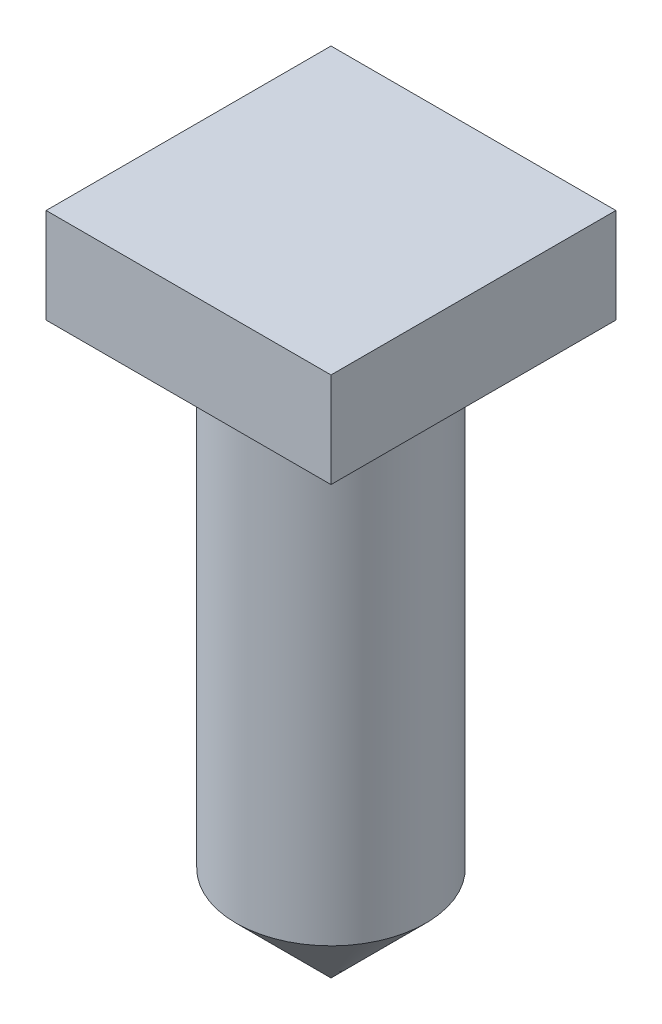
ISO-10303-21;
HEADER;
FILE_DESCRIPTION(('STEP AP214'),'2;1');
FILE_NAME('part.step','',(''),(''),'','','');
FILE_SCHEMA(('AUTOMOTIVE_DESIGN { 1 0 10303 214 1 1 1 1 }'));
ENDSEC;
DATA;
#1=APPLICATION_CONTEXT('core data for automotive mechanical design processes');
#2=APPLICATION_PROTOCOL_DEFINITION('international standard','automotive_design',2000,#1);
#3=PRODUCT_CONTEXT('',#1,'mechanical');
#4=PRODUCT('Part','Part','',(#3));
#5=PRODUCT_RELATED_PRODUCT_CATEGORY('part','',(#4));
#6=PRODUCT_DEFINITION_FORMATION('','',#4);
#7=PRODUCT_DEFINITION_CONTEXT('part definition',#1,'design');
#8=PRODUCT_DEFINITION('design','',#6,#7);
#9=PRODUCT_DEFINITION_SHAPE('','',#8);
#10=(LENGTH_UNIT() NAMED_UNIT(*) SI_UNIT(.MILLI.,.METRE.));
#11=(NAMED_UNIT(*) PLANE_ANGLE_UNIT() SI_UNIT($,.RADIAN.));
#12=(NAMED_UNIT(*) SI_UNIT($,.STERADIAN.) SOLID_ANGLE_UNIT());
#13=UNCERTAINTY_MEASURE_WITH_UNIT(LENGTH_MEASURE(1.E-05),#10,'distance_accuracy_value','');
#14=(GEOMETRIC_REPRESENTATION_CONTEXT(3) GLOBAL_UNCERTAINTY_ASSIGNED_CONTEXT((#13)) GLOBAL_UNIT_ASSIGNED_CONTEXT((#10,
#11,#12)) REPRESENTATION_CONTEXT('',''));
#15=CARTESIAN_POINT('',(0.,0.,0.));
#16=DIRECTION('',(0.,0.,1.));
#17=DIRECTION('',(1.,0.,0.));
#18=AXIS2_PLACEMENT_3D('',#15,#16,#17);
#19=CARTESIAN_POINT('',(0.,0.,0.));
#20=DIRECTION('',(0.,1.,0.));
#21=DIRECTION('',(0.,0.,1.));
#22=AXIS2_PLACEMENT_3D('',#19,#20,#21);
#23=CONICAL_SURFACE('',#22,2.,0.78539816339745);
#24=CARTESIAN_POINT('',(0.,-1.99999999999999,0.));
#25=VERTEX_POINT('',#24);
#26=VERTEX_LOOP('',#25);
#27=FACE_BOUND('',#26,.T.);
#28=CARTESIAN_POINT('',(0.,0.,0.));
#29=DIRECTION('',(0.,1.,0.));
#30=DIRECTION('',(0.,0.,1.));
#31=AXIS2_PLACEMENT_3D('',#28,#29,#30);
#32=CIRCLE('',#31,2.);
#33=CARTESIAN_POINT('',(0.,0.,2.));
#34=VERTEX_POINT('',#33);
#35=EDGE_CURVE('E11',#34,#34,#32,.T.);
#36=ORIENTED_EDGE('',*,*,#35,.F.);
#37=EDGE_LOOP('',(#36));
#38=FACE_BOUND('',#37,.T.);
#39=ADVANCED_FACE('F33',(#27,#38),#23,.T.);
#40=CARTESIAN_POINT('',(0.,10.,0.));
#41=DIRECTION('',(0.,-1.,0.));
#42=DIRECTION('',(0.,0.,-1.));
#43=AXIS2_PLACEMENT_3D('',#40,#41,#42);
#44=CYLINDRICAL_SURFACE('',#43,2.);
#45=CARTESIAN_POINT('',(0.,10.,0.));
#46=DIRECTION('',(0.,1.,0.));
#47=DIRECTION('',(0.,0.,1.));
#48=AXIS2_PLACEMENT_3D('',#45,#46,#47);
#49=CIRCLE('',#48,2.);
#50=CARTESIAN_POINT('',(0.,10.,2.));
#51=VERTEX_POINT('',#50);
#52=EDGE_CURVE('E40',#51,#51,#49,.T.);
#53=ORIENTED_EDGE('',*,*,#52,.F.);
#54=EDGE_LOOP('',(#53));
#55=FACE_BOUND('',#54,.T.);
#56=ORIENTED_EDGE('',*,*,#35,.T.);
#57=EDGE_LOOP('',(#56));
#58=FACE_BOUND('',#57,.T.);
#59=ADVANCED_FACE('F117',(#55,#58),#44,.T.);
#60=CARTESIAN_POINT('',(0.,10.,0.));
#61=DIRECTION('',(0.,-1.,0.));
#62=DIRECTION('',(0.,0.,-1.));
#63=AXIS2_PLACEMENT_3D('',#60,#61,#62);
#64=PLANE('',#63);
#65=DIRECTION('',(0.,0.,-1.));
#66=VECTOR('',#65,1.);
#67=CARTESIAN_POINT('',(3.,10.,3.));
#68=LINE('',#67,#66);
#69=CARTESIAN_POINT('',(3.,10.,3.));
#70=VERTEX_POINT('',#69);
#71=CARTESIAN_POINT('',(3.,10.,-3.));
#72=VERTEX_POINT('',#71);
#73=EDGE_CURVE('E103',#70,#72,#68,.T.);
#74=ORIENTED_EDGE('',*,*,#73,.F.);
#75=DIRECTION('',(1.,0.,0.));
#76=VECTOR('',#75,1.);
#77=CARTESIAN_POINT('',(-3.,10.,3.));
#78=LINE('',#77,#76);
#79=CARTESIAN_POINT('',(-3.,10.,3.));
#80=VERTEX_POINT('',#79);
#81=EDGE_CURVE('E71',#80,#70,#78,.T.);
#82=ORIENTED_EDGE('',*,*,#81,.F.);
#83=DIRECTION('',(0.,0.,1.));
#84=VECTOR('',#83,1.);
#85=CARTESIAN_POINT('',(-3.,10.,3.));
#86=LINE('',#85,#84);
#87=CARTESIAN_POINT('',(-3.,10.,-3.));
#88=VERTEX_POINT('',#87);
#89=EDGE_CURVE('E107',#88,#80,#86,.T.);
#90=ORIENTED_EDGE('',*,*,#89,.F.);
#91=DIRECTION('',(-1.,0.,0.));
#92=VECTOR('',#91,1.);
#93=CARTESIAN_POINT('',(-3.,10.,-3.));
#94=LINE('',#93,#92);
#95=EDGE_CURVE('E91',#72,#88,#94,.T.);
#96=ORIENTED_EDGE('',*,*,#95,.F.);
#97=EDGE_LOOP('',(#74,#82,#90,#96));
#98=FACE_BOUND('',#97,.T.);
#99=ORIENTED_EDGE('',*,*,#52,.T.);
#100=EDGE_LOOP('',(#99));
#101=FACE_BOUND('',#100,.T.);
#102=ADVANCED_FACE('F115',(#98,#101),#64,.T.);
#103=CARTESIAN_POINT('',(3.,12.,3.));
#104=DIRECTION('',(-1.,0.,0.));
#105=DIRECTION('',(0.,0.,1.));
#106=AXIS2_PLACEMENT_3D('',#103,#104,#105);
#107=PLANE('',#106);
#108=ORIENTED_EDGE('',*,*,#73,.T.);
#109=DIRECTION('',(0.,-1.,0.));
#110=VECTOR('',#109,1.);
#111=CARTESIAN_POINT('',(3.,12.,-3.));
#112=LINE('',#111,#110);
#113=CARTESIAN_POINT('',(3.,12.,-3.));
#114=VERTEX_POINT('',#113);
#115=EDGE_CURVE('E94',#114,#72,#112,.T.);
#116=ORIENTED_EDGE('',*,*,#115,.F.);
#117=DIRECTION('',(0.,0.,-1.));
#118=VECTOR('',#117,1.);
#119=CARTESIAN_POINT('',(3.,12.,3.));
#120=LINE('',#119,#118);
#121=CARTESIAN_POINT('',(3.,12.,3.));
#122=VERTEX_POINT('',#121);
#123=EDGE_CURVE('E85',#122,#114,#120,.T.);
#124=ORIENTED_EDGE('',*,*,#123,.F.);
#125=DIRECTION('',(0.,-1.,0.));
#126=VECTOR('',#125,1.);
#127=CARTESIAN_POINT('',(3.,12.,3.));
#128=LINE('',#127,#126);
#129=EDGE_CURVE('E99',#122,#70,#128,.T.);
#130=ORIENTED_EDGE('',*,*,#129,.T.);
#131=EDGE_LOOP('',(#108,#116,#124,#130));
#132=FACE_BOUND('',#131,.T.);
#133=ADVANCED_FACE('F135',(#132),#107,.F.);
#134=CARTESIAN_POINT('',(-3.,12.,-3.));
#135=DIRECTION('',(0.,0.,1.));
#136=DIRECTION('',(1.,0.,0.));
#137=AXIS2_PLACEMENT_3D('',#134,#135,#136);
#138=PLANE('',#137);
#139=ORIENTED_EDGE('',*,*,#95,.T.);
#140=DIRECTION('',(0.,-1.,0.));
#141=VECTOR('',#140,1.);
#142=CARTESIAN_POINT('',(-3.,12.,-3.));
#143=LINE('',#142,#141);
#144=CARTESIAN_POINT('',(-3.,12.,-3.));
#145=VERTEX_POINT('',#144);
#146=EDGE_CURVE('E89',#145,#88,#143,.T.);
#147=ORIENTED_EDGE('',*,*,#146,.F.);
#148=DIRECTION('',(-1.,0.,0.));
#149=VECTOR('',#148,1.);
#150=CARTESIAN_POINT('',(-3.,12.,-3.));
#151=LINE('',#150,#149);
#152=EDGE_CURVE('E79',#114,#145,#151,.T.);
#153=ORIENTED_EDGE('',*,*,#152,.F.);
#154=ORIENTED_EDGE('',*,*,#115,.T.);
#155=EDGE_LOOP('',(#139,#147,#153,#154));
#156=FACE_BOUND('',#155,.T.);
#157=ADVANCED_FACE('F90',(#156),#138,.F.);
#158=CARTESIAN_POINT('',(-3.,12.,3.));
#159=DIRECTION('',(1.,0.,0.));
#160=DIRECTION('',(0.,0.,-1.));
#161=AXIS2_PLACEMENT_3D('',#158,#159,#160);
#162=PLANE('',#161);
#163=ORIENTED_EDGE('',*,*,#89,.T.);
#164=DIRECTION('',(0.,-1.,0.));
#165=VECTOR('',#164,1.);
#166=CARTESIAN_POINT('',(-3.,12.,3.));
#167=LINE('',#166,#165);
#168=CARTESIAN_POINT('',(-3.,12.,3.));
#169=VERTEX_POINT('',#168);
#170=EDGE_CURVE('E95',#169,#80,#167,.T.);
#171=ORIENTED_EDGE('',*,*,#170,.F.);
#172=DIRECTION('',(0.,0.,1.));
#173=VECTOR('',#172,1.);
#174=CARTESIAN_POINT('',(-3.,12.,3.));
#175=LINE('',#174,#173);
#176=EDGE_CURVE('E82',#145,#169,#175,.T.);
#177=ORIENTED_EDGE('',*,*,#176,.F.);
#178=ORIENTED_EDGE('',*,*,#146,.T.);
#179=EDGE_LOOP('',(#163,#171,#177,#178));
#180=FACE_BOUND('',#179,.T.);
#181=ADVANCED_FACE('F97',(#180),#162,.F.);
#182=CARTESIAN_POINT('',(-3.,12.,3.));
#183=DIRECTION('',(0.,0.,-1.));
#184=DIRECTION('',(-1.,0.,0.));
#185=AXIS2_PLACEMENT_3D('',#182,#183,#184);
#186=PLANE('',#185);
#187=ORIENTED_EDGE('',*,*,#81,.T.);
#188=ORIENTED_EDGE('',*,*,#129,.F.);
#189=DIRECTION('',(1.,0.,0.));
#190=VECTOR('',#189,1.);
#191=CARTESIAN_POINT('',(-3.,12.,3.));
#192=LINE('',#191,#190);
#193=EDGE_CURVE('E51',#169,#122,#192,.T.);
#194=ORIENTED_EDGE('',*,*,#193,.F.);
#195=ORIENTED_EDGE('',*,*,#170,.T.);
#196=EDGE_LOOP('',(#187,#188,#194,#195));
#197=FACE_BOUND('',#196,.T.);
#198=ADVANCED_FACE('F156',(#197),#186,.F.);
#199=CARTESIAN_POINT('',(0.,12.,0.));
#200=DIRECTION('',(0.,-1.,0.));
#201=DIRECTION('',(0.,0.,-1.));
#202=AXIS2_PLACEMENT_3D('',#199,#200,#201);
#203=PLANE('',#202);
#204=ORIENTED_EDGE('',*,*,#123,.T.);
#205=ORIENTED_EDGE('',*,*,#152,.T.);
#206=ORIENTED_EDGE('',*,*,#176,.T.);
#207=ORIENTED_EDGE('',*,*,#193,.T.);
#208=EDGE_LOOP('',(#204,#205,#206,#207));
#209=FACE_BOUND('',#208,.T.);
#210=ADVANCED_FACE('F80',(#209),#203,.F.);
#211=CLOSED_SHELL('',(#39,#59,#102,#133,#157,#181,#198,#210));
#212=MANIFOLD_SOLID_BREP('B2',#211);
#213=ADVANCED_BREP_SHAPE_REPRESENTATION('',(#18,#212),#14);
#214=SHAPE_DEFINITION_REPRESENTATION(#9,#213);
ENDSEC;
END-ISO-10303-21;
